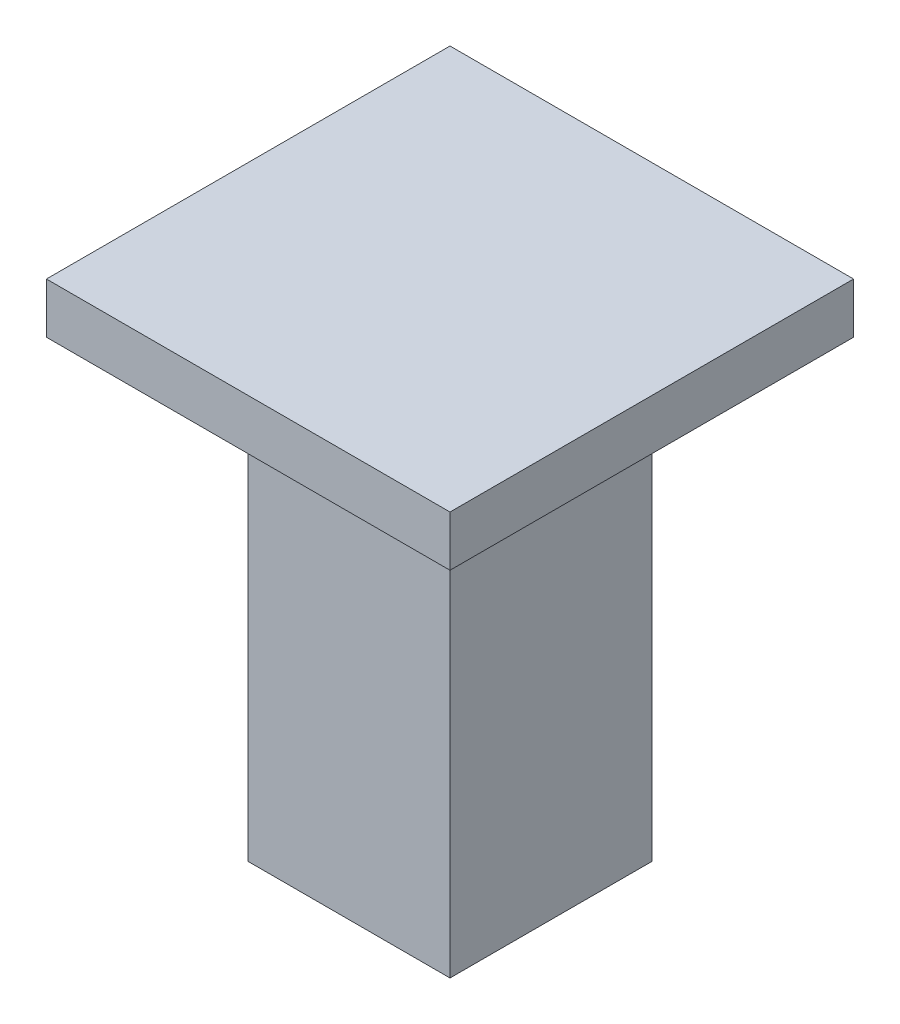
ISO-10303-21;
HEADER;
FILE_DESCRIPTION(('STEP AP214'),'2;1');
FILE_NAME('part.step','',(''),(''),'','','');
FILE_SCHEMA(('AUTOMOTIVE_DESIGN { 1 0 10303 214 1 1 1 1 }'));
ENDSEC;
DATA;
#1=APPLICATION_CONTEXT('core data for automotive mechanical design processes');
#2=APPLICATION_PROTOCOL_DEFINITION('international standard','automotive_design',2000,#1);
#3=PRODUCT_CONTEXT('',#1,'mechanical');
#4=PRODUCT('Part','Part','',(#3));
#5=PRODUCT_RELATED_PRODUCT_CATEGORY('part','',(#4));
#6=PRODUCT_DEFINITION_FORMATION('','',#4);
#7=PRODUCT_DEFINITION_CONTEXT('part definition',#1,'design');
#8=PRODUCT_DEFINITION('design','',#6,#7);
#9=PRODUCT_DEFINITION_SHAPE('','',#8);
#10=(LENGTH_UNIT() NAMED_UNIT(*) SI_UNIT(.MILLI.,.METRE.));
#11=(NAMED_UNIT(*) PLANE_ANGLE_UNIT() SI_UNIT($,.RADIAN.));
#12=(NAMED_UNIT(*) SI_UNIT($,.STERADIAN.) SOLID_ANGLE_UNIT());
#13=UNCERTAINTY_MEASURE_WITH_UNIT(LENGTH_MEASURE(1.E-05),#10,'distance_accuracy_value','');
#14=(GEOMETRIC_REPRESENTATION_CONTEXT(3) GLOBAL_UNCERTAINTY_ASSIGNED_CONTEXT((#13)) GLOBAL_UNIT_ASSIGNED_CONTEXT((#10,
#11,#12)) REPRESENTATION_CONTEXT('',''));
#15=CARTESIAN_POINT('',(0.,0.,0.));
#16=DIRECTION('',(0.,0.,1.));
#17=DIRECTION('',(1.,0.,0.));
#18=AXIS2_PLACEMENT_3D('',#15,#16,#17);
#19=CARTESIAN_POINT('',(0.,50.,0.));
#20=DIRECTION('',(1.,0.,0.));
#21=DIRECTION('',(0.,0.,-1.));
#22=AXIS2_PLACEMENT_3D('',#19,#20,#21);
#23=PLANE('',#22);
#24=DIRECTION('',(0.,0.,1.));
#25=VECTOR('',#24,1.);
#26=CARTESIAN_POINT('',(0.,45.,0.));
#27=LINE('',#26,#25);
#28=CARTESIAN_POINT('',(0.,45.,0.));
#29=VERTEX_POINT('',#28);
#30=CARTESIAN_POINT('',(0.,45.,20.));
#31=VERTEX_POINT('',#30);
#32=EDGE_CURVE('E164',#29,#31,#27,.T.);
#33=ORIENTED_EDGE('',*,*,#32,.F.);
#34=DIRECTION('',(0.,-1.,0.));
#35=VECTOR('',#34,1.);
#36=CARTESIAN_POINT('',(0.,50.,0.));
#37=LINE('',#36,#35);
#38=CARTESIAN_POINT('',(0.,0.,0.));
#39=VERTEX_POINT('',#38);
#40=EDGE_CURVE('E184',#29,#39,#37,.T.);
#41=ORIENTED_EDGE('',*,*,#40,.T.);
#42=DIRECTION('',(0.,0.,1.));
#43=VECTOR('',#42,1.);
#44=CARTESIAN_POINT('',(0.,0.,0.));
#45=LINE('',#44,#43);
#46=CARTESIAN_POINT('',(0.,0.,20.));
#47=VERTEX_POINT('',#46);
#48=EDGE_CURVE('E168',#39,#47,#45,.T.);
#49=ORIENTED_EDGE('',*,*,#48,.T.);
#50=DIRECTION('',(0.,-1.,0.));
#51=VECTOR('',#50,1.);
#52=CARTESIAN_POINT('',(0.,50.,20.));
#53=LINE('',#52,#51);
#54=EDGE_CURVE('E47',#31,#47,#53,.T.);
#55=ORIENTED_EDGE('',*,*,#54,.F.);
#56=EDGE_LOOP('',(#33,#41,#49,#55));
#57=FACE_BOUND('',#56,.T.);
#58=ADVANCED_FACE('F39',(#57),#23,.F.);
#59=CARTESIAN_POINT('',(0.,50.,20.));
#60=DIRECTION('',(0.,0.,-1.));
#61=DIRECTION('',(-1.,0.,0.));
#62=AXIS2_PLACEMENT_3D('',#59,#60,#61);
#63=PLANE('',#62);
#64=DIRECTION('',(1.,0.,0.));
#65=VECTOR('',#64,1.);
#66=CARTESIAN_POINT('',(0.,45.,20.));
#67=LINE('',#66,#65);
#68=CARTESIAN_POINT('',(20.,45.,20.));
#69=VERTEX_POINT('',#68);
#70=EDGE_CURVE('E54',#31,#69,#67,.T.);
#71=ORIENTED_EDGE('',*,*,#70,.F.);
#72=ORIENTED_EDGE('',*,*,#54,.T.);
#73=DIRECTION('',(1.,0.,0.));
#74=VECTOR('',#73,1.);
#75=CARTESIAN_POINT('',(0.,0.,20.));
#76=LINE('',#75,#74);
#77=CARTESIAN_POINT('',(20.,0.,20.));
#78=VERTEX_POINT('',#77);
#79=EDGE_CURVE('E172',#47,#78,#76,.T.);
#80=ORIENTED_EDGE('',*,*,#79,.T.);
#81=DIRECTION('',(0.,-1.,0.));
#82=VECTOR('',#81,1.);
#83=CARTESIAN_POINT('',(20.,50.,20.));
#84=LINE('',#83,#82);
#85=EDGE_CURVE('E190',#69,#78,#84,.T.);
#86=ORIENTED_EDGE('',*,*,#85,.F.);
#87=EDGE_LOOP('',(#71,#72,#80,#86));
#88=FACE_BOUND('',#87,.T.);
#89=ADVANCED_FACE('F194',(#88),#63,.F.);
#90=CARTESIAN_POINT('',(20.,50.,0.));
#91=DIRECTION('',(-1.,0.,0.));
#92=DIRECTION('',(0.,0.,1.));
#93=AXIS2_PLACEMENT_3D('',#90,#91,#92);
#94=PLANE('',#93);
#95=DIRECTION('',(0.,0.,-1.));
#96=VECTOR('',#95,1.);
#97=CARTESIAN_POINT('',(20.,45.,0.));
#98=LINE('',#97,#96);
#99=CARTESIAN_POINT('',(20.,45.,0.));
#100=VERTEX_POINT('',#99);
#101=EDGE_CURVE('E62',#69,#100,#98,.T.);
#102=ORIENTED_EDGE('',*,*,#101,.F.);
#103=ORIENTED_EDGE('',*,*,#85,.T.);
#104=DIRECTION('',(0.,0.,-1.));
#105=VECTOR('',#104,1.);
#106=CARTESIAN_POINT('',(20.,0.,0.));
#107=LINE('',#106,#105);
#108=CARTESIAN_POINT('',(20.,0.,0.));
#109=VERTEX_POINT('',#108);
#110=EDGE_CURVE('E176',#78,#109,#107,.T.);
#111=ORIENTED_EDGE('',*,*,#110,.T.);
#112=DIRECTION('',(0.,-1.,0.));
#113=VECTOR('',#112,1.);
#114=CARTESIAN_POINT('',(20.,50.,0.));
#115=LINE('',#114,#113);
#116=EDGE_CURVE('E187',#100,#109,#115,.T.);
#117=ORIENTED_EDGE('',*,*,#116,.F.);
#118=EDGE_LOOP('',(#102,#103,#111,#117));
#119=FACE_BOUND('',#118,.T.);
#120=ADVANCED_FACE('F204',(#119),#94,.F.);
#121=CARTESIAN_POINT('',(0.,50.,0.));
#122=DIRECTION('',(0.,0.,1.));
#123=DIRECTION('',(1.,0.,0.));
#124=AXIS2_PLACEMENT_3D('',#121,#122,#123);
#125=PLANE('',#124);
#126=DIRECTION('',(-1.,0.,0.));
#127=VECTOR('',#126,1.);
#128=CARTESIAN_POINT('',(0.,45.,0.));
#129=LINE('',#128,#127);
#130=EDGE_CURVE('E11',#100,#29,#129,.T.);
#131=ORIENTED_EDGE('',*,*,#130,.F.);
#132=ORIENTED_EDGE('',*,*,#116,.T.);
#133=DIRECTION('',(-1.,0.,0.));
#134=VECTOR('',#133,1.);
#135=CARTESIAN_POINT('',(0.,0.,0.));
#136=LINE('',#135,#134);
#137=EDGE_CURVE('E180',#109,#39,#136,.T.);
#138=ORIENTED_EDGE('',*,*,#137,.T.);
#139=ORIENTED_EDGE('',*,*,#40,.F.);
#140=EDGE_LOOP('',(#131,#132,#138,#139));
#141=FACE_BOUND('',#140,.T.);
#142=ADVANCED_FACE('F203',(#141),#125,.F.);
#143=CARTESIAN_POINT('',(0.,0.,0.));
#144=DIRECTION('',(0.,1.,0.));
#145=DIRECTION('',(0.,0.,1.));
#146=AXIS2_PLACEMENT_3D('',#143,#144,#145);
#147=PLANE('',#146);
#148=ORIENTED_EDGE('',*,*,#48,.F.);
#149=ORIENTED_EDGE('',*,*,#137,.F.);
#150=ORIENTED_EDGE('',*,*,#110,.F.);
#151=ORIENTED_EDGE('',*,*,#79,.F.);
#152=EDGE_LOOP('',(#148,#149,#150,#151));
#153=FACE_BOUND('',#152,.T.);
#154=ADVANCED_FACE('F200',(#153),#147,.F.);
#155=CARTESIAN_POINT('',(0.,45.,0.));
#156=DIRECTION('',(0.,1.,0.));
#157=DIRECTION('',(0.,0.,1.));
#158=AXIS2_PLACEMENT_3D('',#155,#156,#157);
#159=PLANE('',#158);
#160=DIRECTION('',(0.,0.,1.));
#161=VECTOR('',#160,1.);
#162=CARTESIAN_POINT('',(-10.,45.,-10.));
#163=LINE('',#162,#161);
#164=CARTESIAN_POINT('',(-10.,45.,-10.));
#165=VERTEX_POINT('',#164);
#166=CARTESIAN_POINT('',(-9.99999999999999,45.,30.));
#167=VERTEX_POINT('',#166);
#168=EDGE_CURVE('E125',#165,#167,#163,.T.);
#169=ORIENTED_EDGE('',*,*,#168,.F.);
#170=DIRECTION('',(-1.,0.,0.));
#171=VECTOR('',#170,1.);
#172=CARTESIAN_POINT('',(-10.,45.,-10.));
#173=LINE('',#172,#171);
#174=CARTESIAN_POINT('',(30.,45.,-10.));
#175=VERTEX_POINT('',#174);
#176=EDGE_CURVE('E117',#175,#165,#173,.T.);
#177=ORIENTED_EDGE('',*,*,#176,.F.);
#178=DIRECTION('',(0.,0.,-1.));
#179=VECTOR('',#178,1.);
#180=CARTESIAN_POINT('',(30.,45.,-10.));
#181=LINE('',#180,#179);
#182=CARTESIAN_POINT('',(30.,45.,30.));
#183=VERTEX_POINT('',#182);
#184=EDGE_CURVE('E128',#183,#175,#181,.T.);
#185=ORIENTED_EDGE('',*,*,#184,.F.);
#186=DIRECTION('',(1.,0.,0.));
#187=VECTOR('',#186,1.);
#188=CARTESIAN_POINT('',(-9.99999999999999,45.,30.));
#189=LINE('',#188,#187);
#190=EDGE_CURVE('E108',#167,#183,#189,.T.);
#191=ORIENTED_EDGE('',*,*,#190,.F.);
#192=EDGE_LOOP('',(#169,#177,#185,#191));
#193=FACE_BOUND('',#192,.T.);
#194=ORIENTED_EDGE('',*,*,#130,.T.);
#195=ORIENTED_EDGE('',*,*,#32,.T.);
#196=ORIENTED_EDGE('',*,*,#70,.T.);
#197=ORIENTED_EDGE('',*,*,#101,.T.);
#198=EDGE_LOOP('',(#194,#195,#196,#197));
#199=FACE_BOUND('',#198,.T.);
#200=ADVANCED_FACE('F122',(#193,#199),#159,.F.);
#201=CARTESIAN_POINT('',(-10.,45.,-10.));
#202=DIRECTION('',(-1.,0.,0.));
#203=DIRECTION('',(0.,0.,1.));
#204=AXIS2_PLACEMENT_3D('',#201,#202,#203);
#205=PLANE('',#204);
#206=DIRECTION('',(0.,0.,1.));
#207=VECTOR('',#206,1.);
#208=CARTESIAN_POINT('',(-10.,50.,-10.));
#209=LINE('',#208,#207);
#210=CARTESIAN_POINT('',(-10.,50.,-10.));
#211=VERTEX_POINT('',#210);
#212=CARTESIAN_POINT('',(-9.99999999999999,50.,30.));
#213=VERTEX_POINT('',#212);
#214=EDGE_CURVE('E145',#211,#213,#209,.T.);
#215=ORIENTED_EDGE('',*,*,#214,.F.);
#216=DIRECTION('',(0.,1.,0.));
#217=VECTOR('',#216,1.);
#218=CARTESIAN_POINT('',(-10.,45.,-10.));
#219=LINE('',#218,#217);
#220=EDGE_CURVE('E132',#165,#211,#219,.T.);
#221=ORIENTED_EDGE('',*,*,#220,.F.);
#222=ORIENTED_EDGE('',*,*,#168,.T.);
#223=DIRECTION('',(0.,1.,0.));
#224=VECTOR('',#223,1.);
#225=CARTESIAN_POINT('',(-9.99999999999999,45.,30.));
#226=LINE('',#225,#224);
#227=EDGE_CURVE('E105',#167,#213,#226,.T.);
#228=ORIENTED_EDGE('',*,*,#227,.T.);
#229=EDGE_LOOP('',(#215,#221,#222,#228));
#230=FACE_BOUND('',#229,.T.);
#231=ADVANCED_FACE('F131',(#230),#205,.T.);
#232=CARTESIAN_POINT('',(-10.,45.,-10.));
#233=DIRECTION('',(0.,0.,-1.));
#234=DIRECTION('',(-1.,0.,0.));
#235=AXIS2_PLACEMENT_3D('',#232,#233,#234);
#236=PLANE('',#235);
#237=DIRECTION('',(-1.,0.,0.));
#238=VECTOR('',#237,1.);
#239=CARTESIAN_POINT('',(-10.,50.,-10.));
#240=LINE('',#239,#238);
#241=CARTESIAN_POINT('',(30.,50.,-10.));
#242=VERTEX_POINT('',#241);
#243=EDGE_CURVE('E134',#242,#211,#240,.T.);
#244=ORIENTED_EDGE('',*,*,#243,.F.);
#245=DIRECTION('',(0.,1.,0.));
#246=VECTOR('',#245,1.);
#247=CARTESIAN_POINT('',(30.,45.,-10.));
#248=LINE('',#247,#246);
#249=EDGE_CURVE('E155',#175,#242,#248,.T.);
#250=ORIENTED_EDGE('',*,*,#249,.F.);
#251=ORIENTED_EDGE('',*,*,#176,.T.);
#252=ORIENTED_EDGE('',*,*,#220,.T.);
#253=EDGE_LOOP('',(#244,#250,#251,#252));
#254=FACE_BOUND('',#253,.T.);
#255=ADVANCED_FACE('F211',(#254),#236,.T.);
#256=CARTESIAN_POINT('',(30.,45.,-10.));
#257=DIRECTION('',(1.,0.,0.));
#258=DIRECTION('',(0.,0.,-1.));
#259=AXIS2_PLACEMENT_3D('',#256,#257,#258);
#260=PLANE('',#259);
#261=DIRECTION('',(0.,0.,-1.));
#262=VECTOR('',#261,1.);
#263=CARTESIAN_POINT('',(30.,50.,-10.));
#264=LINE('',#263,#262);
#265=CARTESIAN_POINT('',(30.,50.,30.));
#266=VERTEX_POINT('',#265);
#267=EDGE_CURVE('E138',#266,#242,#264,.T.);
#268=ORIENTED_EDGE('',*,*,#267,.F.);
#269=DIRECTION('',(0.,1.,0.));
#270=VECTOR('',#269,1.);
#271=CARTESIAN_POINT('',(30.,45.,30.));
#272=LINE('',#271,#270);
#273=EDGE_CURVE('E116',#183,#266,#272,.T.);
#274=ORIENTED_EDGE('',*,*,#273,.F.);
#275=ORIENTED_EDGE('',*,*,#184,.T.);
#276=ORIENTED_EDGE('',*,*,#249,.T.);
#277=EDGE_LOOP('',(#268,#274,#275,#276));
#278=FACE_BOUND('',#277,.T.);
#279=ADVANCED_FACE('F232',(#278),#260,.T.);
#280=CARTESIAN_POINT('',(-9.99999999999999,45.,30.));
#281=DIRECTION('',(0.,0.,1.));
#282=DIRECTION('',(1.,0.,0.));
#283=AXIS2_PLACEMENT_3D('',#280,#281,#282);
#284=PLANE('',#283);
#285=DIRECTION('',(1.,0.,0.));
#286=VECTOR('',#285,1.);
#287=CARTESIAN_POINT('',(-9.99999999999999,50.,30.));
#288=LINE('',#287,#286);
#289=EDGE_CURVE('E110',#213,#266,#288,.T.);
#290=ORIENTED_EDGE('',*,*,#289,.F.);
#291=ORIENTED_EDGE('',*,*,#227,.F.);
#292=ORIENTED_EDGE('',*,*,#190,.T.);
#293=ORIENTED_EDGE('',*,*,#273,.T.);
#294=EDGE_LOOP('',(#290,#291,#292,#293));
#295=FACE_BOUND('',#294,.T.);
#296=ADVANCED_FACE('F107',(#295),#284,.T.);
#297=CARTESIAN_POINT('',(0.,50.,0.));
#298=DIRECTION('',(0.,1.,0.));
#299=DIRECTION('',(0.,0.,1.));
#300=AXIS2_PLACEMENT_3D('',#297,#298,#299);
#301=PLANE('',#300);
#302=ORIENTED_EDGE('',*,*,#214,.T.);
#303=ORIENTED_EDGE('',*,*,#289,.T.);
#304=ORIENTED_EDGE('',*,*,#267,.T.);
#305=ORIENTED_EDGE('',*,*,#243,.T.);
#306=EDGE_LOOP('',(#302,#303,#304,#305));
#307=FACE_BOUND('',#306,.T.);
#308=ADVANCED_FACE('F226',(#307),#301,.T.);
#309=CLOSED_SHELL('',(#58,#89,#120,#142,#154,#200,#231,#255,#279,#296,#308));
#310=MANIFOLD_SOLID_BREP('B2',#309);
#311=ADVANCED_BREP_SHAPE_REPRESENTATION('',(#18,#310),#14);
#312=SHAPE_DEFINITION_REPRESENTATION(#9,#311);
ENDSEC;
END-ISO-10303-21;
